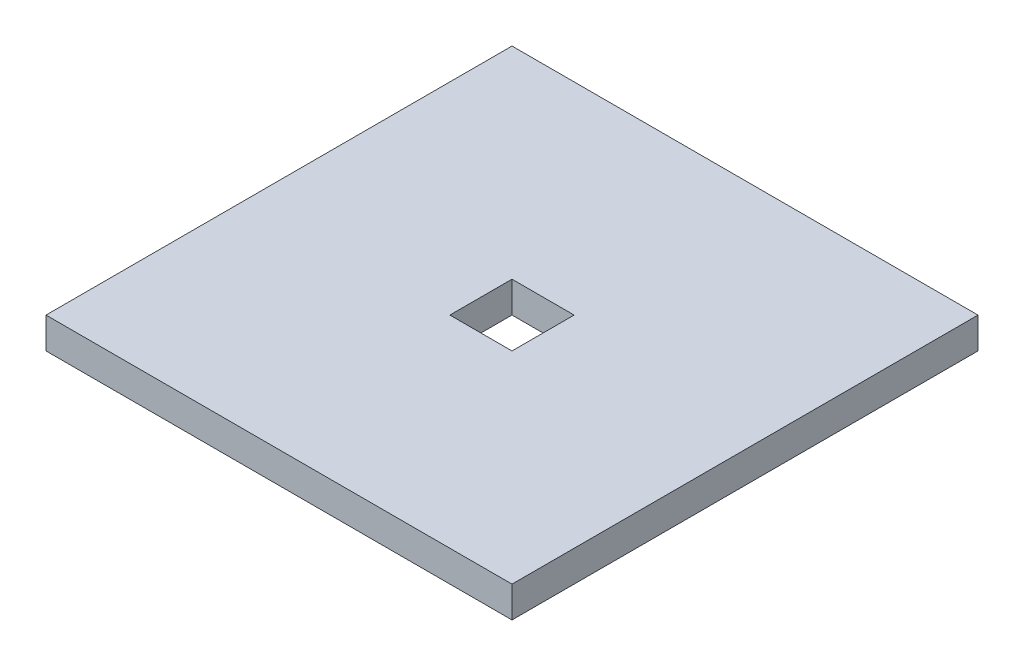
ISO-10303-21;
HEADER;
FILE_DESCRIPTION(('STEP AP214'),'2;1');
FILE_NAME('part.step','',(''),(''),'','','');
FILE_SCHEMA(('AUTOMOTIVE_DESIGN { 1 0 10303 214 1 1 1 1 }'));
ENDSEC;
DATA;
#1=APPLICATION_CONTEXT('core data for automotive mechanical design processes');
#2=APPLICATION_PROTOCOL_DEFINITION('international standard','automotive_design',2000,#1);
#3=PRODUCT_CONTEXT('',#1,'mechanical');
#4=PRODUCT('Part','Part','',(#3));
#5=PRODUCT_RELATED_PRODUCT_CATEGORY('part','',(#4));
#6=PRODUCT_DEFINITION_FORMATION('','',#4);
#7=PRODUCT_DEFINITION_CONTEXT('part definition',#1,'design');
#8=PRODUCT_DEFINITION('design','',#6,#7);
#9=PRODUCT_DEFINITION_SHAPE('','',#8);
#10=(LENGTH_UNIT() NAMED_UNIT(*) SI_UNIT(.MILLI.,.METRE.));
#11=(NAMED_UNIT(*) PLANE_ANGLE_UNIT() SI_UNIT($,.RADIAN.));
#12=(NAMED_UNIT(*) SI_UNIT($,.STERADIAN.) SOLID_ANGLE_UNIT());
#13=UNCERTAINTY_MEASURE_WITH_UNIT(LENGTH_MEASURE(1.E-05),#10,'distance_accuracy_value','');
#14=(GEOMETRIC_REPRESENTATION_CONTEXT(3) GLOBAL_UNCERTAINTY_ASSIGNED_CONTEXT((#13)) GLOBAL_UNIT_ASSIGNED_CONTEXT((#10,
#11,#12)) REPRESENTATION_CONTEXT('',''));
#15=CARTESIAN_POINT('',(0.,0.,0.));
#16=DIRECTION('',(0.,0.,1.));
#17=DIRECTION('',(1.,0.,0.));
#18=AXIS2_PLACEMENT_3D('',#15,#16,#17);
#19=CARTESIAN_POINT('',(0.,100.,-850.));
#20=DIRECTION('',(0.,0.,-1.));
#21=DIRECTION('',(-1.,0.,0.));
#22=AXIS2_PLACEMENT_3D('',#19,#20,#21);
#23=PLANE('',#22);
#24=DIRECTION('',(1.,0.,0.));
#25=VECTOR('',#24,1.);
#26=CARTESIAN_POINT('',(0.,0.,-850.));
#27=LINE('',#26,#25);
#28=CARTESIAN_POINT('',(650.,0.,-850.));
#29=VERTEX_POINT('',#28);
#30=CARTESIAN_POINT('',(850.,0.,-850.));
#31=VERTEX_POINT('',#30);
#32=EDGE_CURVE('E146',#29,#31,#27,.T.);
#33=ORIENTED_EDGE('',*,*,#32,.T.);
#34=DIRECTION('',(0.,-1.,0.));
#35=VECTOR('',#34,1.);
#36=CARTESIAN_POINT('',(850.,100.,-850.));
#37=LINE('',#36,#35);
#38=CARTESIAN_POINT('',(850.,100.,-850.));
#39=VERTEX_POINT('',#38);
#40=EDGE_CURVE('E11',#39,#31,#37,.T.);
#41=ORIENTED_EDGE('',*,*,#40,.F.);
#42=DIRECTION('',(1.,0.,0.));
#43=VECTOR('',#42,1.);
#44=CARTESIAN_POINT('',(0.,100.,-850.));
#45=LINE('',#44,#43);
#46=CARTESIAN_POINT('',(650.,100.,-850.));
#47=VERTEX_POINT('',#46);
#48=EDGE_CURVE('E117',#47,#39,#45,.T.);
#49=ORIENTED_EDGE('',*,*,#48,.F.);
#50=DIRECTION('',(0.,-1.,0.));
#51=VECTOR('',#50,1.);
#52=CARTESIAN_POINT('',(650.,100.,-850.));
#53=LINE('',#52,#51);
#54=EDGE_CURVE('E56',#47,#29,#53,.T.);
#55=ORIENTED_EDGE('',*,*,#54,.T.);
#56=EDGE_LOOP('',(#33,#41,#49,#55));
#57=FACE_BOUND('',#56,.T.);
#58=ADVANCED_FACE('F37',(#57),#23,.F.);
#59=CARTESIAN_POINT('',(850.,100.,0.));
#60=DIRECTION('',(1.,0.,0.));
#61=DIRECTION('',(0.,0.,-1.));
#62=AXIS2_PLACEMENT_3D('',#59,#60,#61);
#63=PLANE('',#62);
#64=DIRECTION('',(0.,0.,1.));
#65=VECTOR('',#64,1.);
#66=CARTESIAN_POINT('',(850.,0.,0.));
#67=LINE('',#66,#65);
#68=CARTESIAN_POINT('',(850.,0.,-650.));
#69=VERTEX_POINT('',#68);
#70=EDGE_CURVE('E123',#31,#69,#67,.T.);
#71=ORIENTED_EDGE('',*,*,#70,.T.);
#72=DIRECTION('',(0.,-1.,0.));
#73=VECTOR('',#72,1.);
#74=CARTESIAN_POINT('',(850.,100.,-650.));
#75=LINE('',#74,#73);
#76=CARTESIAN_POINT('',(850.,100.,-650.));
#77=VERTEX_POINT('',#76);
#78=EDGE_CURVE('E47',#77,#69,#75,.T.);
#79=ORIENTED_EDGE('',*,*,#78,.F.);
#80=DIRECTION('',(0.,0.,1.));
#81=VECTOR('',#80,1.);
#82=CARTESIAN_POINT('',(850.,100.,0.));
#83=LINE('',#82,#81);
#84=EDGE_CURVE('E111',#39,#77,#83,.T.);
#85=ORIENTED_EDGE('',*,*,#84,.F.);
#86=ORIENTED_EDGE('',*,*,#40,.T.);
#87=EDGE_LOOP('',(#71,#79,#85,#86));
#88=FACE_BOUND('',#87,.T.);
#89=ADVANCED_FACE('F122',(#88),#63,.F.);
#90=CARTESIAN_POINT('',(0.,100.,-650.));
#91=DIRECTION('',(0.,0.,-1.));
#92=DIRECTION('',(-1.,0.,0.));
#93=AXIS2_PLACEMENT_3D('',#90,#91,#92);
#94=PLANE('',#93);
#95=DIRECTION('',(1.,0.,0.));
#96=VECTOR('',#95,1.);
#97=CARTESIAN_POINT('',(0.,0.,-650.));
#98=LINE('',#97,#96);
#99=CARTESIAN_POINT('',(650.,0.,-650.));
#100=VERTEX_POINT('',#99);
#101=EDGE_CURVE('E149',#100,#69,#98,.T.);
#102=ORIENTED_EDGE('',*,*,#101,.F.);
#103=DIRECTION('',(0.,-1.,0.));
#104=VECTOR('',#103,1.);
#105=CARTESIAN_POINT('',(650.,100.,-650.));
#106=LINE('',#105,#104);
#107=CARTESIAN_POINT('',(650.,100.,-650.));
#108=VERTEX_POINT('',#107);
#109=EDGE_CURVE('E82',#108,#100,#106,.T.);
#110=ORIENTED_EDGE('',*,*,#109,.F.);
#111=DIRECTION('',(1.,0.,0.));
#112=VECTOR('',#111,1.);
#113=CARTESIAN_POINT('',(0.,100.,-650.));
#114=LINE('',#113,#112);
#115=EDGE_CURVE('E116',#108,#77,#114,.T.);
#116=ORIENTED_EDGE('',*,*,#115,.T.);
#117=ORIENTED_EDGE('',*,*,#78,.T.);
#118=EDGE_LOOP('',(#102,#110,#116,#117));
#119=FACE_BOUND('',#118,.T.);
#120=ADVANCED_FACE('F127',(#119),#94,.T.);
#121=CARTESIAN_POINT('',(0.,100.,0.));
#122=DIRECTION('',(0.,0.,-1.));
#123=DIRECTION('',(-1.,0.,0.));
#124=AXIS2_PLACEMENT_3D('',#121,#122,#123);
#125=PLANE('',#124);
#126=DIRECTION('',(1.,0.,0.));
#127=VECTOR('',#126,1.);
#128=CARTESIAN_POINT('',(0.,0.,0.));
#129=LINE('',#128,#127);
#130=CARTESIAN_POINT('',(0.,0.,0.));
#131=VERTEX_POINT('',#130);
#132=CARTESIAN_POINT('',(1500.,0.,0.));
#133=VERTEX_POINT('',#132);
#134=EDGE_CURVE('E134',#131,#133,#129,.T.);
#135=ORIENTED_EDGE('',*,*,#134,.T.);
#136=DIRECTION('',(0.,-1.,0.));
#137=VECTOR('',#136,1.);
#138=CARTESIAN_POINT('',(1500.,100.,0.));
#139=LINE('',#138,#137);
#140=CARTESIAN_POINT('',(1500.,100.,0.));
#141=VERTEX_POINT('',#140);
#142=EDGE_CURVE('E41',#141,#133,#139,.T.);
#143=ORIENTED_EDGE('',*,*,#142,.F.);
#144=DIRECTION('',(1.,0.,0.));
#145=VECTOR('',#144,1.);
#146=CARTESIAN_POINT('',(0.,100.,0.));
#147=LINE('',#146,#145);
#148=CARTESIAN_POINT('',(0.,100.,0.));
#149=VERTEX_POINT('',#148);
#150=EDGE_CURVE('E154',#149,#141,#147,.T.);
#151=ORIENTED_EDGE('',*,*,#150,.F.);
#152=DIRECTION('',(0.,-1.,0.));
#153=VECTOR('',#152,1.);
#154=CARTESIAN_POINT('',(0.,100.,0.));
#155=LINE('',#154,#153);
#156=EDGE_CURVE('E130',#149,#131,#155,.T.);
#157=ORIENTED_EDGE('',*,*,#156,.T.);
#158=EDGE_LOOP('',(#135,#143,#151,#157));
#159=FACE_BOUND('',#158,.T.);
#160=ADVANCED_FACE('F39',(#159),#125,.F.);
#161=CARTESIAN_POINT('',(1500.,100.,0.));
#162=DIRECTION('',(-1.,0.,0.));
#163=DIRECTION('',(0.,0.,1.));
#164=AXIS2_PLACEMENT_3D('',#161,#162,#163);
#165=PLANE('',#164);
#166=DIRECTION('',(0.,0.,-1.));
#167=VECTOR('',#166,1.);
#168=CARTESIAN_POINT('',(1500.,0.,0.));
#169=LINE('',#168,#167);
#170=CARTESIAN_POINT('',(1500.,0.,-1500.));
#171=VERTEX_POINT('',#170);
#172=EDGE_CURVE('E137',#133,#171,#169,.T.);
#173=ORIENTED_EDGE('',*,*,#172,.T.);
#174=DIRECTION('',(0.,-1.,0.));
#175=VECTOR('',#174,1.);
#176=CARTESIAN_POINT('',(1500.,100.,-1500.));
#177=LINE('',#176,#175);
#178=CARTESIAN_POINT('',(1500.,100.,-1500.));
#179=VERTEX_POINT('',#178);
#180=EDGE_CURVE('E159',#179,#171,#177,.T.);
#181=ORIENTED_EDGE('',*,*,#180,.F.);
#182=DIRECTION('',(0.,0.,-1.));
#183=VECTOR('',#182,1.);
#184=CARTESIAN_POINT('',(1500.,100.,0.));
#185=LINE('',#184,#183);
#186=EDGE_CURVE('E95',#141,#179,#185,.T.);
#187=ORIENTED_EDGE('',*,*,#186,.F.);
#188=ORIENTED_EDGE('',*,*,#142,.T.);
#189=EDGE_LOOP('',(#173,#181,#187,#188));
#190=FACE_BOUND('',#189,.T.);
#191=ADVANCED_FACE('F164',(#190),#165,.F.);
#192=CARTESIAN_POINT('',(0.,100.,-1500.));
#193=DIRECTION('',(0.,0.,-1.));
#194=DIRECTION('',(-1.,0.,0.));
#195=AXIS2_PLACEMENT_3D('',#192,#193,#194);
#196=PLANE('',#195);
#197=DIRECTION('',(1.,0.,0.));
#198=VECTOR('',#197,1.);
#199=CARTESIAN_POINT('',(0.,0.,-1500.));
#200=LINE('',#199,#198);
#201=CARTESIAN_POINT('',(0.,0.,-1500.));
#202=VERTEX_POINT('',#201);
#203=EDGE_CURVE('E140',#202,#171,#200,.T.);
#204=ORIENTED_EDGE('',*,*,#203,.F.);
#205=DIRECTION('',(0.,-1.,0.));
#206=VECTOR('',#205,1.);
#207=CARTESIAN_POINT('',(0.,100.,-1500.));
#208=LINE('',#207,#206);
#209=CARTESIAN_POINT('',(0.,100.,-1500.));
#210=VERTEX_POINT('',#209);
#211=EDGE_CURVE('E158',#210,#202,#208,.T.);
#212=ORIENTED_EDGE('',*,*,#211,.F.);
#213=DIRECTION('',(1.,0.,0.));
#214=VECTOR('',#213,1.);
#215=CARTESIAN_POINT('',(0.,100.,-1500.));
#216=LINE('',#215,#214);
#217=EDGE_CURVE('E205',#210,#179,#216,.T.);
#218=ORIENTED_EDGE('',*,*,#217,.T.);
#219=ORIENTED_EDGE('',*,*,#180,.T.);
#220=EDGE_LOOP('',(#204,#212,#218,#219));
#221=FACE_BOUND('',#220,.T.);
#222=ADVANCED_FACE('F178',(#221),#196,.T.);
#223=CARTESIAN_POINT('',(0.,100.,0.));
#224=DIRECTION('',(-1.,0.,0.));
#225=DIRECTION('',(0.,0.,1.));
#226=AXIS2_PLACEMENT_3D('',#223,#224,#225);
#227=PLANE('',#226);
#228=DIRECTION('',(0.,0.,-1.));
#229=VECTOR('',#228,1.);
#230=CARTESIAN_POINT('',(0.,0.,0.));
#231=LINE('',#230,#229);
#232=EDGE_CURVE('E143',#131,#202,#231,.T.);
#233=ORIENTED_EDGE('',*,*,#232,.F.);
#234=ORIENTED_EDGE('',*,*,#156,.F.);
#235=DIRECTION('',(0.,0.,-1.));
#236=VECTOR('',#235,1.);
#237=CARTESIAN_POINT('',(0.,100.,0.));
#238=LINE('',#237,#236);
#239=EDGE_CURVE('E176',#149,#210,#238,.T.);
#240=ORIENTED_EDGE('',*,*,#239,.T.);
#241=ORIENTED_EDGE('',*,*,#211,.T.);
#242=EDGE_LOOP('',(#233,#234,#240,#241));
#243=FACE_BOUND('',#242,.T.);
#244=ADVANCED_FACE('F173',(#243),#227,.T.);
#245=CARTESIAN_POINT('',(650.,100.,0.));
#246=DIRECTION('',(1.,0.,0.));
#247=DIRECTION('',(0.,0.,-1.));
#248=AXIS2_PLACEMENT_3D('',#245,#246,#247);
#249=PLANE('',#248);
#250=DIRECTION('',(0.,0.,1.));
#251=VECTOR('',#250,1.);
#252=CARTESIAN_POINT('',(650.,0.,0.));
#253=LINE('',#252,#251);
#254=EDGE_CURVE('E151',#29,#100,#253,.T.);
#255=ORIENTED_EDGE('',*,*,#254,.F.);
#256=ORIENTED_EDGE('',*,*,#54,.F.);
#257=DIRECTION('',(0.,0.,1.));
#258=VECTOR('',#257,1.);
#259=CARTESIAN_POINT('',(650.,100.,0.));
#260=LINE('',#259,#258);
#261=EDGE_CURVE('E128',#47,#108,#260,.T.);
#262=ORIENTED_EDGE('',*,*,#261,.T.);
#263=ORIENTED_EDGE('',*,*,#109,.T.);
#264=EDGE_LOOP('',(#255,#256,#262,#263));
#265=FACE_BOUND('',#264,.T.);
#266=ADVANCED_FACE('F185',(#265),#249,.T.);
#267=CARTESIAN_POINT('',(0.,100.,0.));
#268=DIRECTION('',(0.,1.,0.));
#269=DIRECTION('',(0.,0.,1.));
#270=AXIS2_PLACEMENT_3D('',#267,#268,#269);
#271=PLANE('',#270);
#272=ORIENTED_EDGE('',*,*,#150,.T.);
#273=ORIENTED_EDGE('',*,*,#186,.T.);
#274=ORIENTED_EDGE('',*,*,#217,.F.);
#275=ORIENTED_EDGE('',*,*,#239,.F.);
#276=EDGE_LOOP('',(#272,#273,#274,#275));
#277=FACE_BOUND('',#276,.T.);
#278=ORIENTED_EDGE('',*,*,#48,.T.);
#279=ORIENTED_EDGE('',*,*,#84,.T.);
#280=ORIENTED_EDGE('',*,*,#115,.F.);
#281=ORIENTED_EDGE('',*,*,#261,.F.);
#282=EDGE_LOOP('',(#278,#279,#280,#281));
#283=FACE_BOUND('',#282,.T.);
#284=ADVANCED_FACE('F113',(#277,#283),#271,.T.);
#285=CARTESIAN_POINT('',(0.,0.,0.));
#286=DIRECTION('',(0.,1.,0.));
#287=DIRECTION('',(0.,0.,1.));
#288=AXIS2_PLACEMENT_3D('',#285,#286,#287);
#289=PLANE('',#288);
#290=ORIENTED_EDGE('',*,*,#134,.F.);
#291=ORIENTED_EDGE('',*,*,#232,.T.);
#292=ORIENTED_EDGE('',*,*,#203,.T.);
#293=ORIENTED_EDGE('',*,*,#172,.F.);
#294=EDGE_LOOP('',(#290,#291,#292,#293));
#295=FACE_BOUND('',#294,.T.);
#296=ORIENTED_EDGE('',*,*,#32,.F.);
#297=ORIENTED_EDGE('',*,*,#254,.T.);
#298=ORIENTED_EDGE('',*,*,#101,.T.);
#299=ORIENTED_EDGE('',*,*,#70,.F.);
#300=EDGE_LOOP('',(#296,#297,#298,#299));
#301=FACE_BOUND('',#300,.T.);
#302=ADVANCED_FACE('F170',(#295,#301),#289,.F.);
#303=CLOSED_SHELL('',(#58,#89,#120,#160,#191,#222,#244,#266,#284,#302));
#304=MANIFOLD_SOLID_BREP('B2',#303);
#305=ADVANCED_BREP_SHAPE_REPRESENTATION('',(#18,#304),#14);
#306=SHAPE_DEFINITION_REPRESENTATION(#9,#305);
ENDSEC;
END-ISO-10303-21;
